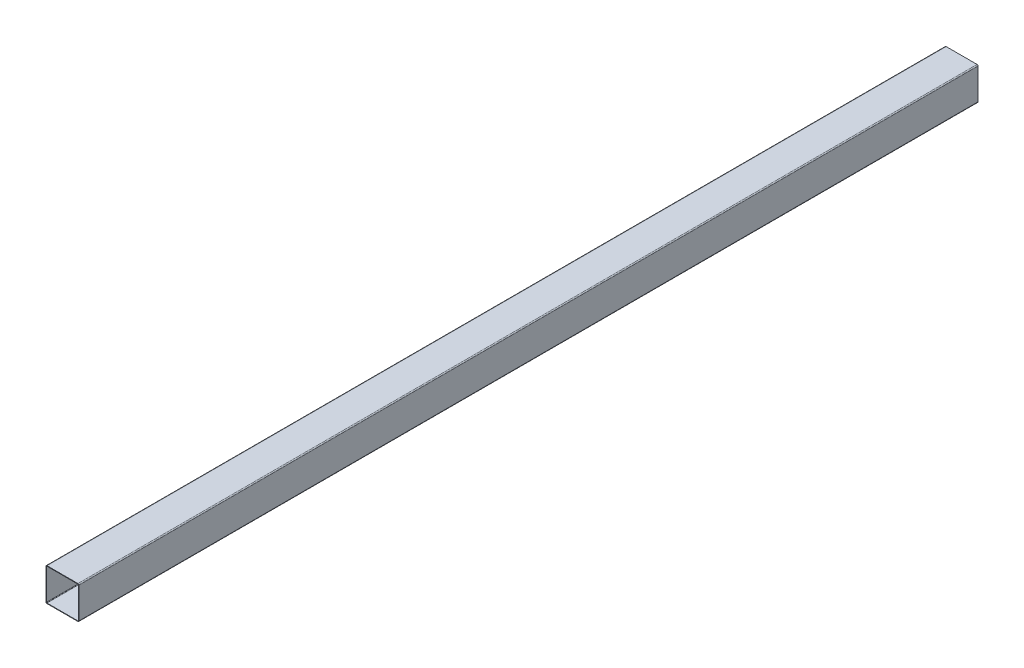
ISO-10303-21;
HEADER;
FILE_DESCRIPTION(('STEP AP214'),'2;1');
FILE_NAME('part.step','',(''),(''),'','','');
FILE_SCHEMA(('AUTOMOTIVE_DESIGN { 1 0 10303 214 1 1 1 1 }'));
ENDSEC;
DATA;
#1=APPLICATION_CONTEXT('core data for automotive mechanical design processes');
#2=APPLICATION_PROTOCOL_DEFINITION('international standard','automotive_design',2000,#1);
#3=PRODUCT_CONTEXT('',#1,'mechanical');
#4=PRODUCT('Part','Part','',(#3));
#5=PRODUCT_RELATED_PRODUCT_CATEGORY('part','',(#4));
#6=PRODUCT_DEFINITION_FORMATION('','',#4);
#7=PRODUCT_DEFINITION_CONTEXT('part definition',#1,'design');
#8=PRODUCT_DEFINITION('design','',#6,#7);
#9=PRODUCT_DEFINITION_SHAPE('','',#8);
#10=(LENGTH_UNIT() NAMED_UNIT(*) SI_UNIT(.MILLI.,.METRE.));
#11=(NAMED_UNIT(*) PLANE_ANGLE_UNIT() SI_UNIT($,.RADIAN.));
#12=(NAMED_UNIT(*) SI_UNIT($,.STERADIAN.) SOLID_ANGLE_UNIT());
#13=UNCERTAINTY_MEASURE_WITH_UNIT(LENGTH_MEASURE(1.E-05),#10,'distance_accuracy_value','');
#14=(GEOMETRIC_REPRESENTATION_CONTEXT(3) GLOBAL_UNCERTAINTY_ASSIGNED_CONTEXT((#13)) GLOBAL_UNIT_ASSIGNED_CONTEXT((#10,
#11,#12)) REPRESENTATION_CONTEXT('',''));
#15=CARTESIAN_POINT('',(0.,0.,0.));
#16=DIRECTION('',(0.,0.,1.));
#17=DIRECTION('',(1.,0.,0.));
#18=AXIS2_PLACEMENT_3D('',#15,#16,#17);
#19=CARTESIAN_POINT('',(50.,47.,1367.5));
#20=DIRECTION('',(-1.,0.,0.));
#21=DIRECTION('',(0.,-1.,0.));
#22=AXIS2_PLACEMENT_3D('',#19,#20,#21);
#23=PLANE('',#22);
#24=DIRECTION('',(0.,0.,-1.));
#25=VECTOR('',#24,1.);
#26=CARTESIAN_POINT('',(50.,47.,1367.5));
#27=LINE('',#26,#25);
#28=CARTESIAN_POINT('',(50.,47.,1367.5));
#29=VERTEX_POINT('',#28);
#30=CARTESIAN_POINT('',(50.,47.,-1367.5));
#31=VERTEX_POINT('',#30);
#32=EDGE_CURVE('E129',#29,#31,#27,.T.);
#33=ORIENTED_EDGE('',*,*,#32,.F.);
#34=DIRECTION('',(0.,1.,0.));
#35=VECTOR('',#34,1.);
#36=CARTESIAN_POINT('',(50.,47.,1367.5));
#37=LINE('',#36,#35);
#38=CARTESIAN_POINT('',(50.,-47.,1367.5));
#39=VERTEX_POINT('',#38);
#40=EDGE_CURVE('E207',#29,#39,#37,.F.);
#41=ORIENTED_EDGE('',*,*,#40,.T.);
#42=DIRECTION('',(0.,0.,-1.));
#43=VECTOR('',#42,1.);
#44=CARTESIAN_POINT('',(50.,-47.,1367.5));
#45=LINE('',#44,#43);
#46=CARTESIAN_POINT('',(50.,-47.,-1367.5));
#47=VERTEX_POINT('',#46);
#48=EDGE_CURVE('E143',#47,#39,#45,.F.);
#49=ORIENTED_EDGE('',*,*,#48,.F.);
#50=DIRECTION('',(0.,1.,0.));
#51=VECTOR('',#50,1.);
#52=CARTESIAN_POINT('',(50.,47.,-1367.5));
#53=LINE('',#52,#51);
#54=EDGE_CURVE('E141',#31,#47,#53,.F.);
#55=ORIENTED_EDGE('',*,*,#54,.F.);
#56=EDGE_LOOP('',(#33,#41,#49,#55));
#57=FACE_BOUND('',#56,.T.);
#58=ADVANCED_FACE('F17',(#57),#23,.F.);
#59=CARTESIAN_POINT('',(47.,-47.,1367.5));
#60=DIRECTION('',(0.,0.,-1.));
#61=DIRECTION('',(-1.,0.,0.));
#62=AXIS2_PLACEMENT_3D('',#59,#60,#61);
#63=CYLINDRICAL_SURFACE('',#62,3.);
#64=CARTESIAN_POINT('',(47.,-47.,1367.5));
#65=DIRECTION('',(0.,0.,-1.));
#66=DIRECTION('',(-1.,0.,0.));
#67=AXIS2_PLACEMENT_3D('',#64,#65,#66);
#68=CIRCLE('',#67,3.);
#69=CARTESIAN_POINT('',(47.,-50.,1367.5));
#70=VERTEX_POINT('',#69);
#71=EDGE_CURVE('E205',#39,#70,#68,.T.);
#72=ORIENTED_EDGE('',*,*,#71,.T.);
#73=DIRECTION('',(0.,0.,1.));
#74=VECTOR('',#73,1.);
#75=CARTESIAN_POINT('',(47.,-50.,1367.5));
#76=LINE('',#75,#74);
#77=CARTESIAN_POINT('',(47.,-50.,-1367.5));
#78=VERTEX_POINT('',#77);
#79=EDGE_CURVE('E178',#70,#78,#76,.F.);
#80=ORIENTED_EDGE('',*,*,#79,.T.);
#81=CARTESIAN_POINT('',(47.,-47.,-1367.5));
#82=DIRECTION('',(0.,0.,-1.));
#83=DIRECTION('',(-1.,0.,0.));
#84=AXIS2_PLACEMENT_3D('',#81,#82,#83);
#85=CIRCLE('',#84,3.);
#86=EDGE_CURVE('E147',#47,#78,#85,.T.);
#87=ORIENTED_EDGE('',*,*,#86,.F.);
#88=ORIENTED_EDGE('',*,*,#48,.T.);
#89=EDGE_LOOP('',(#72,#80,#87,#88));
#90=FACE_BOUND('',#89,.T.);
#91=ADVANCED_FACE('F395',(#90),#63,.T.);
#92=CARTESIAN_POINT('',(-47.,-50.,1367.5));
#93=DIRECTION('',(0.,1.,0.));
#94=DIRECTION('',(0.,0.,1.));
#95=AXIS2_PLACEMENT_3D('',#92,#93,#94);
#96=PLANE('',#95);
#97=ORIENTED_EDGE('',*,*,#79,.F.);
#98=DIRECTION('',(-1.,0.,0.));
#99=VECTOR('',#98,1.);
#100=CARTESIAN_POINT('',(47.,-50.,1367.5));
#101=LINE('',#100,#99);
#102=CARTESIAN_POINT('',(-47.,-50.,1367.5));
#103=VERTEX_POINT('',#102);
#104=EDGE_CURVE('E204',#70,#103,#101,.T.);
#105=ORIENTED_EDGE('',*,*,#104,.T.);
#106=DIRECTION('',(0.,0.,-1.));
#107=VECTOR('',#106,1.);
#108=CARTESIAN_POINT('',(-47.,-50.,1367.5));
#109=LINE('',#108,#107);
#110=CARTESIAN_POINT('',(-47.,-50.,-1367.5));
#111=VERTEX_POINT('',#110);
#112=EDGE_CURVE('E175',#111,#103,#109,.F.);
#113=ORIENTED_EDGE('',*,*,#112,.F.);
#114=DIRECTION('',(-1.,0.,0.));
#115=VECTOR('',#114,1.);
#116=CARTESIAN_POINT('',(47.,-50.,-1367.5));
#117=LINE('',#116,#115);
#118=EDGE_CURVE('E222',#78,#111,#117,.T.);
#119=ORIENTED_EDGE('',*,*,#118,.F.);
#120=EDGE_LOOP('',(#97,#105,#113,#119));
#121=FACE_BOUND('',#120,.T.);
#122=ADVANCED_FACE('F387',(#121),#96,.F.);
#123=CARTESIAN_POINT('',(-47.,-47.,1367.5));
#124=DIRECTION('',(0.,0.,-1.));
#125=DIRECTION('',(-1.,0.,0.));
#126=AXIS2_PLACEMENT_3D('',#123,#124,#125);
#127=CYLINDRICAL_SURFACE('',#126,3.);
#128=CARTESIAN_POINT('',(-47.,-47.,1367.5));
#129=DIRECTION('',(0.,0.,-1.));
#130=DIRECTION('',(-1.,0.,0.));
#131=AXIS2_PLACEMENT_3D('',#128,#129,#130);
#132=CIRCLE('',#131,3.);
#133=CARTESIAN_POINT('',(-50.,-47.,1367.5));
#134=VERTEX_POINT('',#133);
#135=EDGE_CURVE('E202',#103,#134,#132,.T.);
#136=ORIENTED_EDGE('',*,*,#135,.T.);
#137=DIRECTION('',(0.,0.,1.));
#138=VECTOR('',#137,1.);
#139=CARTESIAN_POINT('',(-50.,-47.,1367.5));
#140=LINE('',#139,#138);
#141=CARTESIAN_POINT('',(-50.,-47.,-1367.5));
#142=VERTEX_POINT('',#141);
#143=EDGE_CURVE('E173',#134,#142,#140,.F.);
#144=ORIENTED_EDGE('',*,*,#143,.T.);
#145=CARTESIAN_POINT('',(-47.,-47.,-1367.5));
#146=DIRECTION('',(0.,0.,-1.));
#147=DIRECTION('',(-1.,0.,0.));
#148=AXIS2_PLACEMENT_3D('',#145,#146,#147);
#149=CIRCLE('',#148,3.);
#150=EDGE_CURVE('E220',#111,#142,#149,.T.);
#151=ORIENTED_EDGE('',*,*,#150,.F.);
#152=ORIENTED_EDGE('',*,*,#112,.T.);
#153=EDGE_LOOP('',(#136,#144,#151,#152));
#154=FACE_BOUND('',#153,.T.);
#155=ADVANCED_FACE('F379',(#154),#127,.T.);
#156=CARTESIAN_POINT('',(-50.,47.,1367.5));
#157=DIRECTION('',(1.,0.,0.));
#158=DIRECTION('',(0.,1.,0.));
#159=AXIS2_PLACEMENT_3D('',#156,#157,#158);
#160=PLANE('',#159);
#161=ORIENTED_EDGE('',*,*,#143,.F.);
#162=DIRECTION('',(0.,1.,0.));
#163=VECTOR('',#162,1.);
#164=CARTESIAN_POINT('',(-50.,47.,1367.5));
#165=LINE('',#164,#163);
#166=CARTESIAN_POINT('',(-50.,47.,1367.5));
#167=VERTEX_POINT('',#166);
#168=EDGE_CURVE('E201',#134,#167,#165,.T.);
#169=ORIENTED_EDGE('',*,*,#168,.T.);
#170=DIRECTION('',(0.,0.,-1.));
#171=VECTOR('',#170,1.);
#172=CARTESIAN_POINT('',(-50.,47.,1367.5));
#173=LINE('',#172,#171);
#174=CARTESIAN_POINT('',(-50.,47.,-1367.5));
#175=VERTEX_POINT('',#174);
#176=EDGE_CURVE('E170',#175,#167,#173,.F.);
#177=ORIENTED_EDGE('',*,*,#176,.F.);
#178=DIRECTION('',(0.,1.,0.));
#179=VECTOR('',#178,1.);
#180=CARTESIAN_POINT('',(-50.,47.,-1367.5));
#181=LINE('',#180,#179);
#182=EDGE_CURVE('E219',#142,#175,#181,.T.);
#183=ORIENTED_EDGE('',*,*,#182,.F.);
#184=EDGE_LOOP('',(#161,#169,#177,#183));
#185=FACE_BOUND('',#184,.T.);
#186=ADVANCED_FACE('F371',(#185),#160,.F.);
#187=CARTESIAN_POINT('',(-47.,47.,1367.5));
#188=DIRECTION('',(0.,0.,-1.));
#189=DIRECTION('',(-1.,0.,0.));
#190=AXIS2_PLACEMENT_3D('',#187,#188,#189);
#191=CYLINDRICAL_SURFACE('',#190,3.);
#192=CARTESIAN_POINT('',(-47.,47.,1367.5));
#193=DIRECTION('',(0.,0.,-1.));
#194=DIRECTION('',(-1.,0.,0.));
#195=AXIS2_PLACEMENT_3D('',#192,#193,#194);
#196=CIRCLE('',#195,3.);
#197=CARTESIAN_POINT('',(-47.,50.,1367.5));
#198=VERTEX_POINT('',#197);
#199=EDGE_CURVE('E199',#167,#198,#196,.T.);
#200=ORIENTED_EDGE('',*,*,#199,.T.);
#201=DIRECTION('',(0.,0.,-1.));
#202=VECTOR('',#201,1.);
#203=CARTESIAN_POINT('',(-47.,50.,1367.5));
#204=LINE('',#203,#202);
#205=CARTESIAN_POINT('',(-47.,50.,-1367.5));
#206=VERTEX_POINT('',#205);
#207=EDGE_CURVE('E167',#198,#206,#204,.T.);
#208=ORIENTED_EDGE('',*,*,#207,.T.);
#209=CARTESIAN_POINT('',(-47.,47.,-1367.5));
#210=DIRECTION('',(0.,0.,-1.));
#211=DIRECTION('',(-1.,0.,0.));
#212=AXIS2_PLACEMENT_3D('',#209,#210,#211);
#213=CIRCLE('',#212,3.);
#214=EDGE_CURVE('E217',#175,#206,#213,.T.);
#215=ORIENTED_EDGE('',*,*,#214,.F.);
#216=ORIENTED_EDGE('',*,*,#176,.T.);
#217=EDGE_LOOP('',(#200,#208,#215,#216));
#218=FACE_BOUND('',#217,.T.);
#219=ADVANCED_FACE('F364',(#218),#191,.T.);
#220=CARTESIAN_POINT('',(-47.,50.,1367.5));
#221=DIRECTION('',(0.,-1.,0.));
#222=DIRECTION('',(0.,0.,-1.));
#223=AXIS2_PLACEMENT_3D('',#220,#221,#222);
#224=PLANE('',#223);
#225=ORIENTED_EDGE('',*,*,#207,.F.);
#226=DIRECTION('',(-1.,0.,0.));
#227=VECTOR('',#226,1.);
#228=CARTESIAN_POINT('',(47.,50.,1367.5));
#229=LINE('',#228,#227);
#230=CARTESIAN_POINT('',(47.,50.,1367.5));
#231=VERTEX_POINT('',#230);
#232=EDGE_CURVE('E198',#198,#231,#229,.F.);
#233=ORIENTED_EDGE('',*,*,#232,.T.);
#234=DIRECTION('',(0.,0.,-1.));
#235=VECTOR('',#234,1.);
#236=CARTESIAN_POINT('',(47.,50.,1367.5));
#237=LINE('',#236,#235);
#238=CARTESIAN_POINT('',(47.,50.,-1367.5));
#239=VERTEX_POINT('',#238);
#240=EDGE_CURVE('E124',#239,#231,#237,.F.);
#241=ORIENTED_EDGE('',*,*,#240,.F.);
#242=DIRECTION('',(-1.,0.,0.));
#243=VECTOR('',#242,1.);
#244=CARTESIAN_POINT('',(47.,50.,-1367.5));
#245=LINE('',#244,#243);
#246=EDGE_CURVE('E151',#206,#239,#245,.F.);
#247=ORIENTED_EDGE('',*,*,#246,.F.);
#248=EDGE_LOOP('',(#225,#233,#241,#247));
#249=FACE_BOUND('',#248,.T.);
#250=ADVANCED_FACE('F292',(#249),#224,.F.);
#251=CARTESIAN_POINT('',(47.,47.,1367.5));
#252=DIRECTION('',(0.,0.,-1.));
#253=DIRECTION('',(-1.,0.,0.));
#254=AXIS2_PLACEMENT_3D('',#251,#252,#253);
#255=CYLINDRICAL_SURFACE('',#254,3.);
#256=CARTESIAN_POINT('',(47.,47.,1367.5));
#257=DIRECTION('',(0.,0.,-1.));
#258=DIRECTION('',(-1.,0.,0.));
#259=AXIS2_PLACEMENT_3D('',#256,#257,#258);
#260=CIRCLE('',#259,3.);
#261=EDGE_CURVE('E135',#231,#29,#260,.T.);
#262=ORIENTED_EDGE('',*,*,#261,.T.);
#263=ORIENTED_EDGE('',*,*,#32,.T.);
#264=CARTESIAN_POINT('',(47.,47.,-1367.5));
#265=DIRECTION('',(0.,0.,-1.));
#266=DIRECTION('',(-1.,0.,0.));
#267=AXIS2_PLACEMENT_3D('',#264,#265,#266);
#268=CIRCLE('',#267,3.);
#269=EDGE_CURVE('E20',#239,#31,#268,.T.);
#270=ORIENTED_EDGE('',*,*,#269,.F.);
#271=ORIENTED_EDGE('',*,*,#240,.T.);
#272=EDGE_LOOP('',(#262,#263,#270,#271));
#273=FACE_BOUND('',#272,.T.);
#274=ADVANCED_FACE('F131',(#273),#255,.T.);
#275=CARTESIAN_POINT('',(-48.5,47.,1367.5));
#276=DIRECTION('',(1.,0.,0.));
#277=DIRECTION('',(0.,0.,-1.));
#278=AXIS2_PLACEMENT_3D('',#275,#276,#277);
#279=PLANE('',#278);
#280=DIRECTION('',(0.,1.,0.));
#281=VECTOR('',#280,1.);
#282=CARTESIAN_POINT('',(-48.5,47.,1367.5));
#283=LINE('',#282,#281);
#284=CARTESIAN_POINT('',(-48.5,47.,1367.5));
#285=VERTEX_POINT('',#284);
#286=CARTESIAN_POINT('',(-48.5,-47.,1367.5));
#287=VERTEX_POINT('',#286);
#288=EDGE_CURVE('E196',#285,#287,#283,.F.);
#289=ORIENTED_EDGE('',*,*,#288,.T.);
#290=DIRECTION('',(0.,0.,-1.));
#291=VECTOR('',#290,1.);
#292=CARTESIAN_POINT('',(-48.5,-47.,1367.5));
#293=LINE('',#292,#291);
#294=CARTESIAN_POINT('',(-48.5,-47.,-1367.5));
#295=VERTEX_POINT('',#294);
#296=EDGE_CURVE('E163',#287,#295,#293,.T.);
#297=ORIENTED_EDGE('',*,*,#296,.T.);
#298=DIRECTION('',(0.,1.,0.));
#299=VECTOR('',#298,1.);
#300=CARTESIAN_POINT('',(-48.5,47.,-1367.5));
#301=LINE('',#300,#299);
#302=CARTESIAN_POINT('',(-48.5,47.,-1367.5));
#303=VERTEX_POINT('',#302);
#304=EDGE_CURVE('E215',#303,#295,#301,.F.);
#305=ORIENTED_EDGE('',*,*,#304,.F.);
#306=DIRECTION('',(0.,0.,-1.));
#307=VECTOR('',#306,1.);
#308=CARTESIAN_POINT('',(-48.5,47.,1367.5));
#309=LINE('',#308,#307);
#310=EDGE_CURVE('E159',#303,#285,#309,.F.);
#311=ORIENTED_EDGE('',*,*,#310,.T.);
#312=EDGE_LOOP('',(#289,#297,#305,#311));
#313=FACE_BOUND('',#312,.T.);
#314=ADVANCED_FACE('F281',(#313),#279,.T.);
#315=CARTESIAN_POINT('',(47.,47.,1367.5));
#316=DIRECTION('',(0.,0.,-1.));
#317=DIRECTION('',(-1.,0.,0.));
#318=AXIS2_PLACEMENT_3D('',#315,#316,#317);
#319=CYLINDRICAL_SURFACE('',#318,1.5);
#320=DIRECTION('',(0.,0.,1.));
#321=VECTOR('',#320,1.);
#322=CARTESIAN_POINT('',(48.5,47.,1367.5));
#323=LINE('',#322,#321);
#324=CARTESIAN_POINT('',(48.5,47.,1367.5));
#325=VERTEX_POINT('',#324);
#326=CARTESIAN_POINT('',(48.5,47.,-1367.5));
#327=VERTEX_POINT('',#326);
#328=EDGE_CURVE('E152',#325,#327,#323,.F.);
#329=ORIENTED_EDGE('',*,*,#328,.F.);
#330=CARTESIAN_POINT('',(47.,47.,1367.5));
#331=DIRECTION('',(0.,0.,-1.));
#332=DIRECTION('',(-1.,0.,0.));
#333=AXIS2_PLACEMENT_3D('',#330,#331,#332);
#334=CIRCLE('',#333,1.5);
#335=CARTESIAN_POINT('',(47.,48.5,1367.5));
#336=VERTEX_POINT('',#335);
#337=EDGE_CURVE('E191',#325,#336,#334,.F.);
#338=ORIENTED_EDGE('',*,*,#337,.T.);
#339=DIRECTION('',(0.,0.,-1.));
#340=VECTOR('',#339,1.);
#341=CARTESIAN_POINT('',(47.,48.5,1367.5));
#342=LINE('',#341,#340);
#343=CARTESIAN_POINT('',(47.,48.5,-1367.5));
#344=VERTEX_POINT('',#343);
#345=EDGE_CURVE('E138',#344,#336,#342,.F.);
#346=ORIENTED_EDGE('',*,*,#345,.F.);
#347=CARTESIAN_POINT('',(47.,47.,-1367.5));
#348=DIRECTION('',(0.,0.,-1.));
#349=DIRECTION('',(-1.,0.,0.));
#350=AXIS2_PLACEMENT_3D('',#347,#348,#349);
#351=CIRCLE('',#350,1.5);
#352=EDGE_CURVE('E166',#327,#344,#351,.F.);
#353=ORIENTED_EDGE('',*,*,#352,.F.);
#354=EDGE_LOOP('',(#329,#338,#346,#353));
#355=FACE_BOUND('',#354,.T.);
#356=ADVANCED_FACE('F267',(#355),#319,.F.);
#357=CARTESIAN_POINT('',(-47.,48.5,1367.5));
#358=DIRECTION('',(0.,-1.,0.));
#359=DIRECTION('',(0.,0.,-1.));
#360=AXIS2_PLACEMENT_3D('',#357,#358,#359);
#361=PLANE('',#360);
#362=DIRECTION('',(-1.,0.,0.));
#363=VECTOR('',#362,1.);
#364=CARTESIAN_POINT('',(47.,48.5,1367.5));
#365=LINE('',#364,#363);
#366=CARTESIAN_POINT('',(-47.,48.5,1367.5));
#367=VERTEX_POINT('',#366);
#368=EDGE_CURVE('E190',#336,#367,#365,.T.);
#369=ORIENTED_EDGE('',*,*,#368,.T.);
#370=DIRECTION('',(0.,0.,-1.));
#371=VECTOR('',#370,1.);
#372=CARTESIAN_POINT('',(-47.,48.5,1367.5));
#373=LINE('',#372,#371);
#374=CARTESIAN_POINT('',(-47.,48.5,-1367.5));
#375=VERTEX_POINT('',#374);
#376=EDGE_CURVE('E153',#367,#375,#373,.T.);
#377=ORIENTED_EDGE('',*,*,#376,.T.);
#378=DIRECTION('',(-1.,0.,0.));
#379=VECTOR('',#378,1.);
#380=CARTESIAN_POINT('',(47.,48.5,-1367.5));
#381=LINE('',#380,#379);
#382=EDGE_CURVE('E216',#344,#375,#381,.T.);
#383=ORIENTED_EDGE('',*,*,#382,.F.);
#384=ORIENTED_EDGE('',*,*,#345,.T.);
#385=EDGE_LOOP('',(#369,#377,#383,#384));
#386=FACE_BOUND('',#385,.T.);
#387=ADVANCED_FACE('F237',(#386),#361,.T.);
#388=CARTESIAN_POINT('',(-47.,47.,1367.5));
#389=DIRECTION('',(0.,0.,-1.));
#390=DIRECTION('',(-1.,0.,0.));
#391=AXIS2_PLACEMENT_3D('',#388,#389,#390);
#392=CYLINDRICAL_SURFACE('',#391,1.5);
#393=ORIENTED_EDGE('',*,*,#376,.F.);
#394=CARTESIAN_POINT('',(-47.,47.,1367.5));
#395=DIRECTION('',(0.,0.,-1.));
#396=DIRECTION('',(-1.,0.,0.));
#397=AXIS2_PLACEMENT_3D('',#394,#395,#396);
#398=CIRCLE('',#397,1.5);
#399=EDGE_CURVE('E187',#367,#285,#398,.F.);
#400=ORIENTED_EDGE('',*,*,#399,.T.);
#401=ORIENTED_EDGE('',*,*,#310,.F.);
#402=CARTESIAN_POINT('',(-47.,47.,-1367.5));
#403=DIRECTION('',(0.,0.,-1.));
#404=DIRECTION('',(-1.,0.,0.));
#405=AXIS2_PLACEMENT_3D('',#402,#403,#404);
#406=CIRCLE('',#405,1.5);
#407=EDGE_CURVE('E212',#375,#303,#406,.F.);
#408=ORIENTED_EDGE('',*,*,#407,.F.);
#409=EDGE_LOOP('',(#393,#400,#401,#408));
#410=FACE_BOUND('',#409,.T.);
#411=ADVANCED_FACE('F309',(#410),#392,.F.);
#412=CARTESIAN_POINT('',(48.5,47.,1367.5));
#413=DIRECTION('',(-1.,0.,0.));
#414=DIRECTION('',(0.,-1.,0.));
#415=AXIS2_PLACEMENT_3D('',#412,#413,#414);
#416=PLANE('',#415);
#417=DIRECTION('',(0.,1.,0.));
#418=VECTOR('',#417,1.);
#419=CARTESIAN_POINT('',(48.5,47.,1367.5));
#420=LINE('',#419,#418);
#421=CARTESIAN_POINT('',(48.5,-47.,1367.5));
#422=VERTEX_POINT('',#421);
#423=EDGE_CURVE('E193',#422,#325,#420,.T.);
#424=ORIENTED_EDGE('',*,*,#423,.T.);
#425=ORIENTED_EDGE('',*,*,#328,.T.);
#426=DIRECTION('',(0.,1.,0.));
#427=VECTOR('',#426,1.);
#428=CARTESIAN_POINT('',(48.5,47.,-1367.5));
#429=LINE('',#428,#427);
#430=CARTESIAN_POINT('',(48.5,-47.,-1367.5));
#431=VERTEX_POINT('',#430);
#432=EDGE_CURVE('E211',#431,#327,#429,.T.);
#433=ORIENTED_EDGE('',*,*,#432,.F.);
#434=DIRECTION('',(0.,0.,-1.));
#435=VECTOR('',#434,1.);
#436=CARTESIAN_POINT('',(48.5,-47.,1367.5));
#437=LINE('',#436,#435);
#438=EDGE_CURVE('E186',#431,#422,#437,.F.);
#439=ORIENTED_EDGE('',*,*,#438,.T.);
#440=EDGE_LOOP('',(#424,#425,#433,#439));
#441=FACE_BOUND('',#440,.T.);
#442=ADVANCED_FACE('F268',(#441),#416,.T.);
#443=CARTESIAN_POINT('',(47.,47.,-1367.5));
#444=DIRECTION('',(0.,0.,-1.));
#445=DIRECTION('',(-1.,0.,0.));
#446=AXIS2_PLACEMENT_3D('',#443,#444,#445);
#447=PLANE('',#446);
#448=ORIENTED_EDGE('',*,*,#432,.T.);
#449=ORIENTED_EDGE('',*,*,#352,.T.);
#450=ORIENTED_EDGE('',*,*,#382,.T.);
#451=ORIENTED_EDGE('',*,*,#407,.T.);
#452=ORIENTED_EDGE('',*,*,#304,.T.);
#453=CARTESIAN_POINT('',(-47.,-47.,-1367.5));
#454=DIRECTION('',(0.,0.,-1.));
#455=DIRECTION('',(-1.,0.,0.));
#456=AXIS2_PLACEMENT_3D('',#453,#454,#455);
#457=CIRCLE('',#456,1.50000000000001);
#458=CARTESIAN_POINT('',(-47.,-48.5,-1367.5));
#459=VERTEX_POINT('',#458);
#460=EDGE_CURVE('E165',#295,#459,#457,.F.);
#461=ORIENTED_EDGE('',*,*,#460,.T.);
#462=DIRECTION('',(1.,0.,0.));
#463=VECTOR('',#462,1.);
#464=CARTESIAN_POINT('',(-47.,-48.5,-1367.5));
#465=LINE('',#464,#463);
#466=CARTESIAN_POINT('',(47.,-48.5,-1367.5));
#467=VERTEX_POINT('',#466);
#468=EDGE_CURVE('E184',#467,#459,#465,.F.);
#469=ORIENTED_EDGE('',*,*,#468,.F.);
#470=CARTESIAN_POINT('',(47.,-47.,-1367.5));
#471=DIRECTION('',(0.,0.,-1.));
#472=DIRECTION('',(-1.,0.,0.));
#473=AXIS2_PLACEMENT_3D('',#470,#471,#472);
#474=CIRCLE('',#473,1.5);
#475=EDGE_CURVE('E181',#467,#431,#474,.F.);
#476=ORIENTED_EDGE('',*,*,#475,.T.);
#477=EDGE_LOOP('',(#448,#449,#450,#451,#452,#461,#469,#476));
#478=FACE_BOUND('',#477,.T.);
#479=ORIENTED_EDGE('',*,*,#214,.T.);
#480=ORIENTED_EDGE('',*,*,#246,.T.);
#481=ORIENTED_EDGE('',*,*,#269,.T.);
#482=ORIENTED_EDGE('',*,*,#54,.T.);
#483=ORIENTED_EDGE('',*,*,#86,.T.);
#484=ORIENTED_EDGE('',*,*,#118,.T.);
#485=ORIENTED_EDGE('',*,*,#150,.T.);
#486=ORIENTED_EDGE('',*,*,#182,.T.);
#487=EDGE_LOOP('',(#479,#480,#481,#482,#483,#484,#485,#486));
#488=FACE_BOUND('',#487,.T.);
#489=ADVANCED_FACE('F150',(#478,#488),#447,.T.);
#490=CARTESIAN_POINT('',(-47.,-47.,1367.5));
#491=DIRECTION('',(0.,0.,-1.));
#492=DIRECTION('',(-1.,0.,0.));
#493=AXIS2_PLACEMENT_3D('',#490,#491,#492);
#494=CYLINDRICAL_SURFACE('',#493,1.50000000000001);
#495=ORIENTED_EDGE('',*,*,#296,.F.);
#496=CARTESIAN_POINT('',(-47.,-47.,1367.5));
#497=DIRECTION('',(0.,0.,-1.));
#498=DIRECTION('',(-1.,0.,0.));
#499=AXIS2_PLACEMENT_3D('',#496,#497,#498);
#500=CIRCLE('',#499,1.50000000000001);
#501=CARTESIAN_POINT('',(-47.,-48.5,1367.5));
#502=VERTEX_POINT('',#501);
#503=EDGE_CURVE('E194',#287,#502,#500,.F.);
#504=ORIENTED_EDGE('',*,*,#503,.T.);
#505=DIRECTION('',(0.,0.,1.));
#506=VECTOR('',#505,1.);
#507=CARTESIAN_POINT('',(-47.,-48.5,1367.5));
#508=LINE('',#507,#506);
#509=EDGE_CURVE('E254',#459,#502,#508,.T.);
#510=ORIENTED_EDGE('',*,*,#509,.F.);
#511=ORIENTED_EDGE('',*,*,#460,.F.);
#512=EDGE_LOOP('',(#495,#504,#510,#511));
#513=FACE_BOUND('',#512,.T.);
#514=ADVANCED_FACE('F279',(#513),#494,.F.);
#515=CARTESIAN_POINT('',(47.,47.,1367.5));
#516=DIRECTION('',(0.,0.,-1.));
#517=DIRECTION('',(-1.,0.,0.));
#518=AXIS2_PLACEMENT_3D('',#515,#516,#517);
#519=PLANE('',#518);
#520=ORIENTED_EDGE('',*,*,#368,.F.);
#521=ORIENTED_EDGE('',*,*,#337,.F.);
#522=ORIENTED_EDGE('',*,*,#423,.F.);
#523=CARTESIAN_POINT('',(47.,-47.,1367.5));
#524=DIRECTION('',(0.,0.,-1.));
#525=DIRECTION('',(-1.,0.,0.));
#526=AXIS2_PLACEMENT_3D('',#523,#524,#525);
#527=CIRCLE('',#526,1.5);
#528=CARTESIAN_POINT('',(47.,-48.5,1367.5));
#529=VERTEX_POINT('',#528);
#530=EDGE_CURVE('E35',#422,#529,#527,.T.);
#531=ORIENTED_EDGE('',*,*,#530,.T.);
#532=DIRECTION('',(1.,0.,0.));
#533=VECTOR('',#532,1.);
#534=CARTESIAN_POINT('',(-47.,-48.5,1367.5));
#535=LINE('',#534,#533);
#536=EDGE_CURVE('E26',#502,#529,#535,.T.);
#537=ORIENTED_EDGE('',*,*,#536,.F.);
#538=ORIENTED_EDGE('',*,*,#503,.F.);
#539=ORIENTED_EDGE('',*,*,#288,.F.);
#540=ORIENTED_EDGE('',*,*,#399,.F.);
#541=EDGE_LOOP('',(#520,#521,#522,#531,#537,#538,#539,#540));
#542=FACE_BOUND('',#541,.T.);
#543=ORIENTED_EDGE('',*,*,#232,.F.);
#544=ORIENTED_EDGE('',*,*,#199,.F.);
#545=ORIENTED_EDGE('',*,*,#168,.F.);
#546=ORIENTED_EDGE('',*,*,#135,.F.);
#547=ORIENTED_EDGE('',*,*,#104,.F.);
#548=ORIENTED_EDGE('',*,*,#71,.F.);
#549=ORIENTED_EDGE('',*,*,#40,.F.);
#550=ORIENTED_EDGE('',*,*,#261,.F.);
#551=EDGE_LOOP('',(#543,#544,#545,#546,#547,#548,#549,#550));
#552=FACE_BOUND('',#551,.T.);
#553=ADVANCED_FACE('F243',(#542,#552),#519,.F.);
#554=CARTESIAN_POINT('',(47.,-47.,1367.5));
#555=DIRECTION('',(0.,0.,-1.));
#556=DIRECTION('',(-1.,0.,0.));
#557=AXIS2_PLACEMENT_3D('',#554,#555,#556);
#558=CYLINDRICAL_SURFACE('',#557,1.5);
#559=DIRECTION('',(0.,0.,1.));
#560=VECTOR('',#559,1.);
#561=CARTESIAN_POINT('',(47.,-48.5,1367.5));
#562=LINE('',#561,#560);
#563=EDGE_CURVE('E11',#529,#467,#562,.F.);
#564=ORIENTED_EDGE('',*,*,#563,.F.);
#565=ORIENTED_EDGE('',*,*,#530,.F.);
#566=ORIENTED_EDGE('',*,*,#438,.F.);
#567=ORIENTED_EDGE('',*,*,#475,.F.);
#568=EDGE_LOOP('',(#564,#565,#566,#567));
#569=FACE_BOUND('',#568,.T.);
#570=ADVANCED_FACE('F271',(#569),#558,.F.);
#571=CARTESIAN_POINT('',(-47.,-48.5,1367.5));
#572=DIRECTION('',(0.,1.,0.));
#573=DIRECTION('',(0.,0.,1.));
#574=AXIS2_PLACEMENT_3D('',#571,#572,#573);
#575=PLANE('',#574);
#576=ORIENTED_EDGE('',*,*,#536,.T.);
#577=ORIENTED_EDGE('',*,*,#563,.T.);
#578=ORIENTED_EDGE('',*,*,#468,.T.);
#579=ORIENTED_EDGE('',*,*,#509,.T.);
#580=EDGE_LOOP('',(#576,#577,#578,#579));
#581=FACE_BOUND('',#580,.T.);
#582=ADVANCED_FACE('F274',(#581),#575,.T.);
#583=CLOSED_SHELL('',(#58,#91,#122,#155,#186,#219,#250,#274,#314,#356,#387,#411,#442,#489,#514,
#553,#570,#582));
#584=MANIFOLD_SOLID_BREP('B1',#583);
#585=ADVANCED_BREP_SHAPE_REPRESENTATION('',(#18,#584),#14);
#586=SHAPE_DEFINITION_REPRESENTATION(#9,#585);
ENDSEC;
END-ISO-10303-21;
